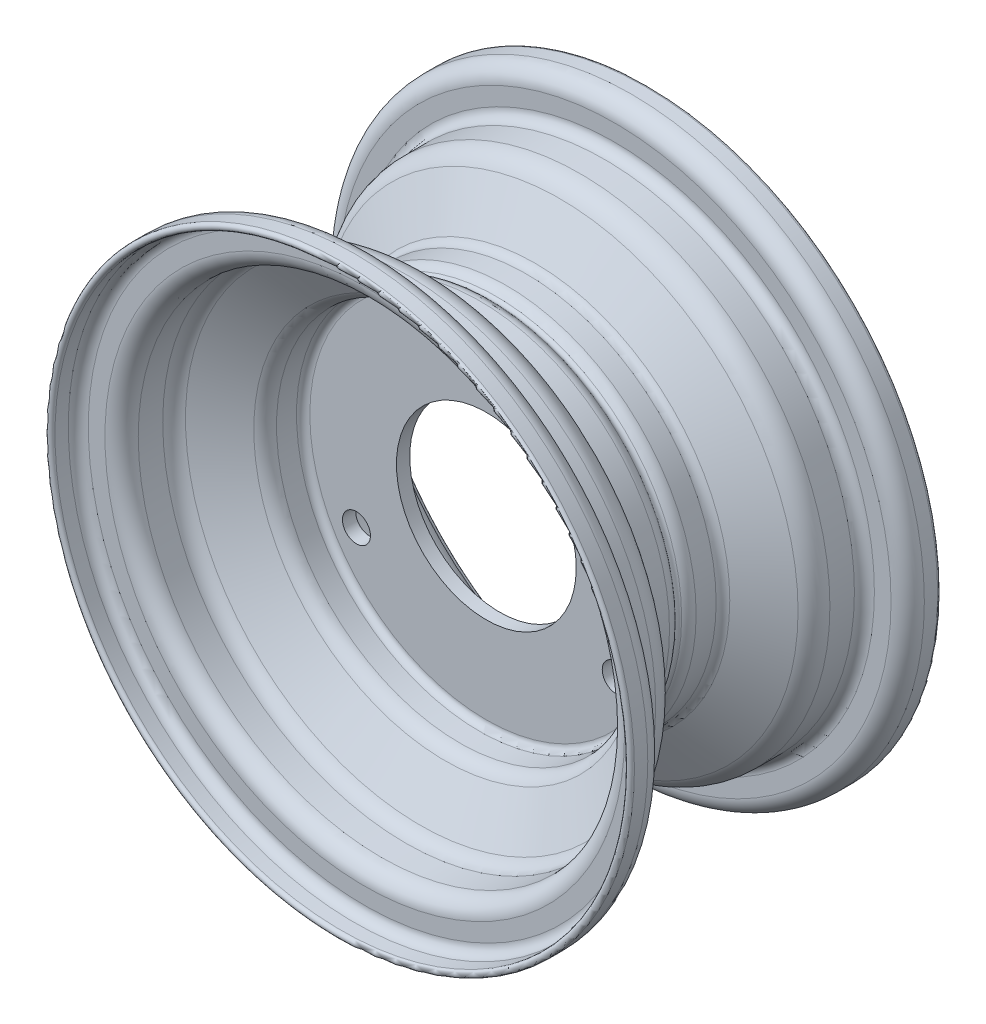
ISO-10303-21;
HEADER;
FILE_DESCRIPTION(('STEP AP214'),'2;1');
FILE_NAME('part.step','',(''),(''),'','','');
FILE_SCHEMA(('AUTOMOTIVE_DESIGN { 1 0 10303 214 1 1 1 1 }'));
ENDSEC;
DATA;
#1=APPLICATION_CONTEXT('core data for automotive mechanical design processes');
#2=APPLICATION_PROTOCOL_DEFINITION('international standard','automotive_design',2000,#1);
#3=PRODUCT_CONTEXT('',#1,'mechanical');
#4=PRODUCT('Part','Part','',(#3));
#5=PRODUCT_RELATED_PRODUCT_CATEGORY('part','',(#4));
#6=PRODUCT_DEFINITION_FORMATION('','',#4);
#7=PRODUCT_DEFINITION_CONTEXT('part definition',#1,'design');
#8=PRODUCT_DEFINITION('design','',#6,#7);
#9=PRODUCT_DEFINITION_SHAPE('','',#8);
#10=(LENGTH_UNIT() NAMED_UNIT(*) SI_UNIT(.MILLI.,.METRE.));
#11=(NAMED_UNIT(*) PLANE_ANGLE_UNIT() SI_UNIT($,.RADIAN.));
#12=(NAMED_UNIT(*) SI_UNIT($,.STERADIAN.) SOLID_ANGLE_UNIT());
#13=UNCERTAINTY_MEASURE_WITH_UNIT(LENGTH_MEASURE(1.E-05),#10,'distance_accuracy_value','');
#14=(GEOMETRIC_REPRESENTATION_CONTEXT(3) GLOBAL_UNCERTAINTY_ASSIGNED_CONTEXT((#13)) GLOBAL_UNIT_ASSIGNED_CONTEXT((#10,
#11,#12)) REPRESENTATION_CONTEXT('',''));
#15=CARTESIAN_POINT('',(0.,0.,0.));
#16=DIRECTION('',(0.,0.,1.));
#17=DIRECTION('',(1.,0.,0.));
#18=AXIS2_PLACEMENT_3D('',#15,#16,#17);
#19=CARTESIAN_POINT('',(0.,0.,10.));
#20=DIRECTION('',(0.,0.,1.));
#21=DIRECTION('',(1.,0.,0.));
#22=AXIS2_PLACEMENT_3D('',#19,#20,#21);
#23=TOROIDAL_SURFACE('',#22,60.,5.);
#24=CARTESIAN_POINT('',(0.,0.,10.));
#25=DIRECTION('',(0.,0.,1.));
#26=DIRECTION('',(1.,0.,0.));
#27=AXIS2_PLACEMENT_3D('',#24,#25,#26);
#28=CIRCLE('',#27,55.);
#29=CARTESIAN_POINT('',(55.,0.,10.));
#30=VERTEX_POINT('',#29);
#31=EDGE_CURVE('E49',#30,#30,#28,.T.);
#32=ORIENTED_EDGE('',*,*,#31,.F.);
#33=EDGE_LOOP('',(#32));
#34=FACE_BOUND('',#33,.T.);
#35=CARTESIAN_POINT('',(0.,0.,14.3301270189222));
#36=DIRECTION('',(0.,0.,1.));
#37=DIRECTION('',(1.,0.,0.));
#38=AXIS2_PLACEMENT_3D('',#35,#36,#37);
#39=CIRCLE('',#38,57.5);
#40=CARTESIAN_POINT('',(57.5,0.,14.3301270189222));
#41=VERTEX_POINT('',#40);
#42=EDGE_CURVE('E10',#41,#41,#39,.T.);
#43=ORIENTED_EDGE('',*,*,#42,.T.);
#44=EDGE_LOOP('',(#43));
#45=FACE_BOUND('',#44,.T.);
#46=ADVANCED_FACE('F31',(#34,#45),#23,.T.);
#47=CARTESIAN_POINT('',(0.,0.,21.8356805183874));
#48=DIRECTION('',(0.,0.,1.));
#49=DIRECTION('',(1.,0.,0.));
#50=AXIS2_PLACEMENT_3D('',#47,#48,#49);
#51=CONICAL_SURFACE('',#50,70.5,1.0471975511966);
#52=ORIENTED_EDGE('',*,*,#42,.F.);
#53=EDGE_LOOP('',(#52));
#54=FACE_BOUND('',#53,.T.);
#55=CARTESIAN_POINT('',(0.,0.,21.8356805183874));
#56=DIRECTION('',(0.,0.,1.));
#57=DIRECTION('',(1.,0.,0.));
#58=AXIS2_PLACEMENT_3D('',#55,#56,#57);
#59=CIRCLE('',#58,70.5);
#60=CARTESIAN_POINT('',(70.5,0.,21.8356805183874));
#61=VERTEX_POINT('',#60);
#62=EDGE_CURVE('E38',#61,#61,#59,.T.);
#63=ORIENTED_EDGE('',*,*,#62,.T.);
#64=EDGE_LOOP('',(#63));
#65=FACE_BOUND('',#64,.T.);
#66=ADVANCED_FACE('F460',(#54,#65),#51,.F.);
#67=CARTESIAN_POINT('',(0.,0.,26.1658075373096));
#68=DIRECTION('',(0.,0.,1.));
#69=DIRECTION('',(1.,0.,0.));
#70=AXIS2_PLACEMENT_3D('',#67,#68,#69);
#71=TOROIDAL_SURFACE('',#70,68.,5.);
#72=ORIENTED_EDGE('',*,*,#62,.F.);
#73=EDGE_LOOP('',(#72));
#74=FACE_BOUND('',#73,.T.);
#75=CARTESIAN_POINT('',(0.,0.,26.1658075373096));
#76=DIRECTION('',(0.,0.,1.));
#77=DIRECTION('',(1.,0.,0.));
#78=AXIS2_PLACEMENT_3D('',#75,#76,#77);
#79=CIRCLE('',#78,73.);
#80=CARTESIAN_POINT('',(73.,0.,26.1658075373096));
#81=VERTEX_POINT('',#80);
#82=EDGE_CURVE('E43',#81,#81,#79,.T.);
#83=ORIENTED_EDGE('',*,*,#82,.T.);
#84=EDGE_LOOP('',(#83));
#85=FACE_BOUND('',#84,.T.);
#86=ADVANCED_FACE('F196',(#74,#85),#71,.F.);
#87=CARTESIAN_POINT('',(0.,0.,10.1111111111111));
#88=DIRECTION('',(0.,0.,1.));
#89=DIRECTION('',(1.,0.,0.));
#90=AXIS2_PLACEMENT_3D('',#87,#88,#89);
#91=CYLINDRICAL_SURFACE('',#90,73.);
#92=ORIENTED_EDGE('',*,*,#82,.F.);
#93=EDGE_LOOP('',(#92));
#94=FACE_BOUND('',#93,.T.);
#95=CARTESIAN_POINT('',(0.,0.,33.5213292810915));
#96=DIRECTION('',(0.,0.,1.));
#97=DIRECTION('',(1.,0.,0.));
#98=AXIS2_PLACEMENT_3D('',#95,#96,#97);
#99=CIRCLE('',#98,73.);
#100=CARTESIAN_POINT('',(73.,0.,33.5213292810915));
#101=VERTEX_POINT('',#100);
#102=EDGE_CURVE('E191',#101,#101,#99,.T.);
#103=ORIENTED_EDGE('',*,*,#102,.T.);
#104=EDGE_LOOP('',(#103));
#105=FACE_BOUND('',#104,.T.);
#106=ADVANCED_FACE('F198',(#94,#105),#91,.F.);
#107=CARTESIAN_POINT('',(0.,0.,33.5213292810915));
#108=DIRECTION('',(0.,0.,1.));
#109=DIRECTION('',(1.,0.,0.));
#110=AXIS2_PLACEMENT_3D('',#107,#108,#109);
#111=TOROIDAL_SURFACE('',#110,78.,5.);
#112=ORIENTED_EDGE('',*,*,#102,.F.);
#113=EDGE_LOOP('',(#112));
#114=FACE_BOUND('',#113,.T.);
#115=CARTESIAN_POINT('',(0.,0.,38.5213292810915));
#116=DIRECTION('',(0.,0.,1.));
#117=DIRECTION('',(1.,0.,0.));
#118=AXIS2_PLACEMENT_3D('',#115,#116,#117);
#119=CIRCLE('',#118,78.);
#120=CARTESIAN_POINT('',(78.,0.,38.5213292810915));
#121=VERTEX_POINT('',#120);
#122=EDGE_CURVE('E188',#121,#121,#119,.T.);
#123=ORIENTED_EDGE('',*,*,#122,.T.);
#124=EDGE_LOOP('',(#123));
#125=FACE_BOUND('',#124,.T.);
#126=ADVANCED_FACE('F201',(#114,#125),#111,.T.);
#127=CARTESIAN_POINT('',(0.,78.,38.5213292810915));
#128=DIRECTION('',(0.,0.,-1.));
#129=DIRECTION('',(-1.,0.,0.));
#130=AXIS2_PLACEMENT_3D('',#127,#128,#129);
#131=PLANE('',#130);
#132=ORIENTED_EDGE('',*,*,#122,.F.);
#133=EDGE_LOOP('',(#132));
#134=FACE_BOUND('',#133,.T.);
#135=CARTESIAN_POINT('',(0.,0.,38.5213292810915));
#136=DIRECTION('',(0.,0.,1.));
#137=DIRECTION('',(1.,0.,0.));
#138=AXIS2_PLACEMENT_3D('',#135,#136,#137);
#139=CIRCLE('',#138,83.);
#140=CARTESIAN_POINT('',(83.,0.,38.5213292810915));
#141=VERTEX_POINT('',#140);
#142=EDGE_CURVE('E185',#141,#141,#139,.T.);
#143=ORIENTED_EDGE('',*,*,#142,.T.);
#144=EDGE_LOOP('',(#143));
#145=FACE_BOUND('',#144,.T.);
#146=ADVANCED_FACE('F207',(#134,#145),#131,.F.);
#147=CARTESIAN_POINT('',(0.,0.,41.5213292810915));
#148=DIRECTION('',(0.,0.,1.));
#149=DIRECTION('',(1.,0.,0.));
#150=AXIS2_PLACEMENT_3D('',#147,#148,#149);
#151=TOROIDAL_SURFACE('',#150,83.,3.00000000000001);
#152=ORIENTED_EDGE('',*,*,#142,.F.);
#153=EDGE_LOOP('',(#152));
#154=FACE_BOUND('',#153,.T.);
#155=CARTESIAN_POINT('',(0.,0.,41.5213292810915));
#156=DIRECTION('',(0.,0.,1.));
#157=DIRECTION('',(1.,0.,0.));
#158=AXIS2_PLACEMENT_3D('',#155,#156,#157);
#159=CIRCLE('',#158,86.);
#160=CARTESIAN_POINT('',(86.,0.,41.5213292810915));
#161=VERTEX_POINT('',#160);
#162=EDGE_CURVE('E182',#161,#161,#159,.T.);
#163=ORIENTED_EDGE('',*,*,#162,.T.);
#164=EDGE_LOOP('',(#163));
#165=FACE_BOUND('',#164,.T.);
#166=ADVANCED_FACE('F213',(#154,#165),#151,.F.);
#167=CARTESIAN_POINT('',(0.,0.,10.1111111111111));
#168=DIRECTION('',(0.,0.,1.));
#169=DIRECTION('',(1.,0.,0.));
#170=AXIS2_PLACEMENT_3D('',#167,#168,#169);
#171=CYLINDRICAL_SURFACE('',#170,86.);
#172=ORIENTED_EDGE('',*,*,#162,.F.);
#173=EDGE_LOOP('',(#172));
#174=FACE_BOUND('',#173,.T.);
#175=CARTESIAN_POINT('',(0.,0.,45.5213292810915));
#176=DIRECTION('',(0.,0.,1.));
#177=DIRECTION('',(1.,0.,0.));
#178=AXIS2_PLACEMENT_3D('',#175,#176,#177);
#179=CIRCLE('',#178,86.);
#180=CARTESIAN_POINT('',(86.,0.,45.5213292810915));
#181=VERTEX_POINT('',#180);
#182=EDGE_CURVE('E179',#181,#181,#179,.T.);
#183=ORIENTED_EDGE('',*,*,#182,.T.);
#184=EDGE_LOOP('',(#183));
#185=FACE_BOUND('',#184,.T.);
#186=ADVANCED_FACE('F219',(#174,#185),#171,.F.);
#187=CARTESIAN_POINT('',(0.,0.,45.5213292810915));
#188=DIRECTION('',(0.,0.,1.));
#189=DIRECTION('',(1.,0.,0.));
#190=AXIS2_PLACEMENT_3D('',#187,#188,#189);
#191=TOROIDAL_SURFACE('',#190,87.,1.);
#192=ORIENTED_EDGE('',*,*,#182,.F.);
#193=EDGE_LOOP('',(#192));
#194=FACE_BOUND('',#193,.T.);
#195=CARTESIAN_POINT('',(0.,0.,45.5213292810915));
#196=DIRECTION('',(0.,0.,1.));
#197=DIRECTION('',(1.,0.,0.));
#198=AXIS2_PLACEMENT_3D('',#195,#196,#197);
#199=CIRCLE('',#198,88.);
#200=CARTESIAN_POINT('',(88.,0.,45.5213292810915));
#201=VERTEX_POINT('',#200);
#202=EDGE_CURVE('E176',#201,#201,#199,.T.);
#203=ORIENTED_EDGE('',*,*,#202,.T.);
#204=EDGE_LOOP('',(#203));
#205=FACE_BOUND('',#204,.T.);
#206=ADVANCED_FACE('F225',(#194,#205),#191,.T.);
#207=CARTESIAN_POINT('',(0.,0.,10.1111111111111));
#208=DIRECTION('',(0.,0.,1.));
#209=DIRECTION('',(1.,0.,0.));
#210=AXIS2_PLACEMENT_3D('',#207,#208,#209);
#211=CYLINDRICAL_SURFACE('',#210,88.);
#212=ORIENTED_EDGE('',*,*,#202,.F.);
#213=EDGE_LOOP('',(#212));
#214=FACE_BOUND('',#213,.T.);
#215=CARTESIAN_POINT('',(0.,0.,41.5213292810915));
#216=DIRECTION('',(0.,0.,1.));
#217=DIRECTION('',(1.,0.,0.));
#218=AXIS2_PLACEMENT_3D('',#215,#216,#217);
#219=CIRCLE('',#218,88.);
#220=CARTESIAN_POINT('',(88.,0.,41.5213292810915));
#221=VERTEX_POINT('',#220);
#222=EDGE_CURVE('E173',#221,#221,#219,.T.);
#223=ORIENTED_EDGE('',*,*,#222,.T.);
#224=EDGE_LOOP('',(#223));
#225=FACE_BOUND('',#224,.T.);
#226=ADVANCED_FACE('F231',(#214,#225),#211,.T.);
#227=CARTESIAN_POINT('',(0.,0.,41.5213292810915));
#228=DIRECTION('',(0.,0.,1.));
#229=DIRECTION('',(1.,0.,0.));
#230=AXIS2_PLACEMENT_3D('',#227,#228,#229);
#231=TOROIDAL_SURFACE('',#230,83.,5.);
#232=ORIENTED_EDGE('',*,*,#222,.F.);
#233=EDGE_LOOP('',(#232));
#234=FACE_BOUND('',#233,.T.);
#235=CARTESIAN_POINT('',(0.,0.,36.5213292810915));
#236=DIRECTION('',(0.,0.,1.));
#237=DIRECTION('',(1.,0.,0.));
#238=AXIS2_PLACEMENT_3D('',#235,#236,#237);
#239=CIRCLE('',#238,83.);
#240=CARTESIAN_POINT('',(83.,0.,36.5213292810915));
#241=VERTEX_POINT('',#240);
#242=EDGE_CURVE('E170',#241,#241,#239,.T.);
#243=ORIENTED_EDGE('',*,*,#242,.T.);
#244=EDGE_LOOP('',(#243));
#245=FACE_BOUND('',#244,.T.);
#246=ADVANCED_FACE('F237',(#234,#245),#231,.T.);
#247=CARTESIAN_POINT('',(0.,83.,36.5213292810915));
#248=DIRECTION('',(0.,0.,1.));
#249=DIRECTION('',(1.,0.,0.));
#250=AXIS2_PLACEMENT_3D('',#247,#248,#249);
#251=PLANE('',#250);
#252=ORIENTED_EDGE('',*,*,#242,.F.);
#253=EDGE_LOOP('',(#252));
#254=FACE_BOUND('',#253,.T.);
#255=CARTESIAN_POINT('',(0.,0.,36.5213292810915));
#256=DIRECTION('',(0.,0.,1.));
#257=DIRECTION('',(1.,0.,0.));
#258=AXIS2_PLACEMENT_3D('',#255,#256,#257);
#259=CIRCLE('',#258,78.);
#260=CARTESIAN_POINT('',(78.,0.,36.5213292810915));
#261=VERTEX_POINT('',#260);
#262=EDGE_CURVE('E167',#261,#261,#259,.T.);
#263=ORIENTED_EDGE('',*,*,#262,.T.);
#264=EDGE_LOOP('',(#263));
#265=FACE_BOUND('',#264,.T.);
#266=ADVANCED_FACE('F243',(#254,#265),#251,.F.);
#267=CARTESIAN_POINT('',(0.,0.,33.5213292810915));
#268=DIRECTION('',(0.,0.,1.));
#269=DIRECTION('',(1.,0.,0.));
#270=AXIS2_PLACEMENT_3D('',#267,#268,#269);
#271=TOROIDAL_SURFACE('',#270,78.,3.);
#272=ORIENTED_EDGE('',*,*,#262,.F.);
#273=EDGE_LOOP('',(#272));
#274=FACE_BOUND('',#273,.T.);
#275=CARTESIAN_POINT('',(0.,0.,33.5213292810915));
#276=DIRECTION('',(0.,0.,1.));
#277=DIRECTION('',(1.,0.,0.));
#278=AXIS2_PLACEMENT_3D('',#275,#276,#277);
#279=CIRCLE('',#278,75.);
#280=CARTESIAN_POINT('',(75.,0.,33.5213292810915));
#281=VERTEX_POINT('',#280);
#282=EDGE_CURVE('E164',#281,#281,#279,.T.);
#283=ORIENTED_EDGE('',*,*,#282,.T.);
#284=EDGE_LOOP('',(#283));
#285=FACE_BOUND('',#284,.T.);
#286=ADVANCED_FACE('F249',(#274,#285),#271,.F.);
#287=CARTESIAN_POINT('',(0.,0.,10.1111111111111));
#288=DIRECTION('',(0.,0.,1.));
#289=DIRECTION('',(1.,0.,0.));
#290=AXIS2_PLACEMENT_3D('',#287,#288,#289);
#291=CYLINDRICAL_SURFACE('',#290,75.);
#292=ORIENTED_EDGE('',*,*,#282,.F.);
#293=EDGE_LOOP('',(#292));
#294=FACE_BOUND('',#293,.T.);
#295=CARTESIAN_POINT('',(0.,0.,26.1658075373096));
#296=DIRECTION('',(0.,0.,1.));
#297=DIRECTION('',(1.,0.,0.));
#298=AXIS2_PLACEMENT_3D('',#295,#296,#297);
#299=CIRCLE('',#298,75.);
#300=CARTESIAN_POINT('',(75.,0.,26.1658075373096));
#301=VERTEX_POINT('',#300);
#302=EDGE_CURVE('E161',#301,#301,#299,.T.);
#303=ORIENTED_EDGE('',*,*,#302,.T.);
#304=EDGE_LOOP('',(#303));
#305=FACE_BOUND('',#304,.T.);
#306=ADVANCED_FACE('F255',(#294,#305),#291,.T.);
#307=CARTESIAN_POINT('',(0.,0.,26.1658075373096));
#308=DIRECTION('',(0.,0.,1.));
#309=DIRECTION('',(1.,0.,0.));
#310=AXIS2_PLACEMENT_3D('',#307,#308,#309);
#311=TOROIDAL_SURFACE('',#310,68.,7.00000000000003);
#312=ORIENTED_EDGE('',*,*,#302,.F.);
#313=EDGE_LOOP('',(#312));
#314=FACE_BOUND('',#313,.T.);
#315=CARTESIAN_POINT('',(0.,0.,20.1036297108185));
#316=DIRECTION('',(0.,0.,1.));
#317=DIRECTION('',(1.,0.,0.));
#318=AXIS2_PLACEMENT_3D('',#315,#316,#317);
#319=CIRCLE('',#318,71.5);
#320=CARTESIAN_POINT('',(71.5,0.,20.1036297108185));
#321=VERTEX_POINT('',#320);
#322=EDGE_CURVE('E158',#321,#321,#319,.T.);
#323=ORIENTED_EDGE('',*,*,#322,.T.);
#324=EDGE_LOOP('',(#323));
#325=FACE_BOUND('',#324,.T.);
#326=ADVANCED_FACE('F261',(#314,#325),#311,.T.);
#327=CARTESIAN_POINT('',(0.,0.,12.5980762113533));
#328=DIRECTION('',(0.,0.,1.));
#329=DIRECTION('',(1.,0.,0.));
#330=AXIS2_PLACEMENT_3D('',#327,#328,#329);
#331=CONICAL_SURFACE('',#330,58.5,1.0471975511966);
#332=ORIENTED_EDGE('',*,*,#322,.F.);
#333=EDGE_LOOP('',(#332));
#334=FACE_BOUND('',#333,.T.);
#335=CARTESIAN_POINT('',(0.,0.,12.5980762113533));
#336=DIRECTION('',(0.,0.,1.));
#337=DIRECTION('',(1.,0.,0.));
#338=AXIS2_PLACEMENT_3D('',#335,#336,#337);
#339=CIRCLE('',#338,58.5);
#340=CARTESIAN_POINT('',(58.5,0.,12.5980762113533));
#341=VERTEX_POINT('',#340);
#342=EDGE_CURVE('E155',#341,#341,#339,.T.);
#343=ORIENTED_EDGE('',*,*,#342,.T.);
#344=EDGE_LOOP('',(#343));
#345=FACE_BOUND('',#344,.T.);
#346=ADVANCED_FACE('F267',(#334,#345),#331,.T.);
#347=CARTESIAN_POINT('',(0.,0.,10.));
#348=DIRECTION('',(0.,0.,1.));
#349=DIRECTION('',(1.,0.,0.));
#350=AXIS2_PLACEMENT_3D('',#347,#348,#349);
#351=TOROIDAL_SURFACE('',#350,60.,2.99999999999997);
#352=ORIENTED_EDGE('',*,*,#342,.F.);
#353=EDGE_LOOP('',(#352));
#354=FACE_BOUND('',#353,.T.);
#355=CARTESIAN_POINT('',(0.,0.,10.));
#356=DIRECTION('',(0.,0.,1.));
#357=DIRECTION('',(1.,0.,0.));
#358=AXIS2_PLACEMENT_3D('',#355,#356,#357);
#359=CIRCLE('',#358,57.);
#360=CARTESIAN_POINT('',(57.,0.,10.));
#361=VERTEX_POINT('',#360);
#362=EDGE_CURVE('E152',#361,#361,#359,.T.);
#363=ORIENTED_EDGE('',*,*,#362,.T.);
#364=EDGE_LOOP('',(#363));
#365=FACE_BOUND('',#364,.T.);
#366=ADVANCED_FACE('F273',(#354,#365),#351,.F.);
#367=CARTESIAN_POINT('',(0.,0.,10.1111111111111));
#368=DIRECTION('',(0.,0.,1.));
#369=DIRECTION('',(1.,0.,0.));
#370=AXIS2_PLACEMENT_3D('',#367,#368,#369);
#371=CYLINDRICAL_SURFACE('',#370,57.);
#372=ORIENTED_EDGE('',*,*,#362,.F.);
#373=EDGE_LOOP('',(#372));
#374=FACE_BOUND('',#373,.T.);
#375=CARTESIAN_POINT('',(0.,0.,4.));
#376=DIRECTION('',(0.,0.,1.));
#377=DIRECTION('',(1.,0.,0.));
#378=AXIS2_PLACEMENT_3D('',#375,#376,#377);
#379=CIRCLE('',#378,57.);
#380=CARTESIAN_POINT('',(57.,0.,4.));
#381=VERTEX_POINT('',#380);
#382=EDGE_CURVE('E149',#381,#381,#379,.T.);
#383=ORIENTED_EDGE('',*,*,#382,.T.);
#384=EDGE_LOOP('',(#383));
#385=FACE_BOUND('',#384,.T.);
#386=ADVANCED_FACE('F279',(#374,#385),#371,.T.);
#387=CARTESIAN_POINT('',(0.,0.,4.));
#388=DIRECTION('',(0.,0.,1.));
#389=DIRECTION('',(1.,0.,0.));
#390=AXIS2_PLACEMENT_3D('',#387,#388,#389);
#391=TOROIDAL_SURFACE('',#390,53.,4.00000000000001);
#392=ORIENTED_EDGE('',*,*,#382,.F.);
#393=EDGE_LOOP('',(#392));
#394=FACE_BOUND('',#393,.T.);
#395=CARTESIAN_POINT('',(0.,0.,1.));
#396=DIRECTION('',(0.,0.,1.));
#397=DIRECTION('',(1.,0.,0.));
#398=AXIS2_PLACEMENT_3D('',#395,#396,#397);
#399=CIRCLE('',#398,55.6457513110646);
#400=CARTESIAN_POINT('',(55.6457513110646,0.,1.));
#401=VERTEX_POINT('',#400);
#402=EDGE_CURVE('E146',#401,#401,#399,.T.);
#403=ORIENTED_EDGE('',*,*,#402,.T.);
#404=EDGE_LOOP('',(#403));
#405=FACE_BOUND('',#404,.T.);
#406=ADVANCED_FACE('F285',(#394,#405),#391,.T.);
#407=CARTESIAN_POINT('',(0.,0.,0.));
#408=DIRECTION('',(0.,0.,1.));
#409=DIRECTION('',(1.,0.,0.));
#410=AXIS2_PLACEMENT_3D('',#407,#408,#409);
#411=TOROIDAL_SURFACE('',#410,56.5276684147528,1.33333333333334);
#412=ORIENTED_EDGE('',*,*,#402,.F.);
#413=EDGE_LOOP('',(#412));
#414=FACE_BOUND('',#413,.T.);
#415=CARTESIAN_POINT('',(0.,0.,-0.999999999999997));
#416=DIRECTION('',(0.,0.,1.));
#417=DIRECTION('',(1.,0.,0.));
#418=AXIS2_PLACEMENT_3D('',#415,#416,#417);
#419=CIRCLE('',#418,55.6457513110646);
#420=CARTESIAN_POINT('',(55.6457513110646,0.,-0.999999999999997));
#421=VERTEX_POINT('',#420);
#422=EDGE_CURVE('E143',#421,#421,#419,.T.);
#423=ORIENTED_EDGE('',*,*,#422,.T.);
#424=EDGE_LOOP('',(#423));
#425=FACE_BOUND('',#424,.T.);
#426=ADVANCED_FACE('F291',(#414,#425),#411,.F.);
#427=CARTESIAN_POINT('',(0.,0.,-4.));
#428=DIRECTION('',(0.,0.,1.));
#429=DIRECTION('',(1.,0.,0.));
#430=AXIS2_PLACEMENT_3D('',#427,#428,#429);
#431=TOROIDAL_SURFACE('',#430,53.,4.00000000000001);
#432=ORIENTED_EDGE('',*,*,#422,.F.);
#433=EDGE_LOOP('',(#432));
#434=FACE_BOUND('',#433,.T.);
#435=CARTESIAN_POINT('',(0.,0.,-4.00000000000005));
#436=DIRECTION('',(0.,0.,1.));
#437=DIRECTION('',(1.,0.,0.));
#438=AXIS2_PLACEMENT_3D('',#435,#436,#437);
#439=CIRCLE('',#438,57.);
#440=CARTESIAN_POINT('',(57.,0.,-4.00000000000005));
#441=VERTEX_POINT('',#440);
#442=EDGE_CURVE('E140',#441,#441,#439,.T.);
#443=ORIENTED_EDGE('',*,*,#442,.T.);
#444=EDGE_LOOP('',(#443));
#445=FACE_BOUND('',#444,.T.);
#446=ADVANCED_FACE('F297',(#434,#445),#431,.T.);
#447=CARTESIAN_POINT('',(0.,0.,10.1111111111111));
#448=DIRECTION('',(0.,0.,1.));
#449=DIRECTION('',(1.,0.,0.));
#450=AXIS2_PLACEMENT_3D('',#447,#448,#449);
#451=CYLINDRICAL_SURFACE('',#450,57.);
#452=ORIENTED_EDGE('',*,*,#442,.F.);
#453=EDGE_LOOP('',(#452));
#454=FACE_BOUND('',#453,.T.);
#455=CARTESIAN_POINT('',(0.,0.,-10.));
#456=DIRECTION('',(0.,0.,1.));
#457=DIRECTION('',(1.,0.,0.));
#458=AXIS2_PLACEMENT_3D('',#455,#456,#457);
#459=CIRCLE('',#458,57.);
#460=CARTESIAN_POINT('',(57.,0.,-10.));
#461=VERTEX_POINT('',#460);
#462=EDGE_CURVE('E137',#461,#461,#459,.T.);
#463=ORIENTED_EDGE('',*,*,#462,.T.);
#464=EDGE_LOOP('',(#463));
#465=FACE_BOUND('',#464,.T.);
#466=ADVANCED_FACE('F303',(#454,#465),#451,.T.);
#467=CARTESIAN_POINT('',(0.,0.,-10.));
#468=DIRECTION('',(0.,0.,1.));
#469=DIRECTION('',(1.,0.,0.));
#470=AXIS2_PLACEMENT_3D('',#467,#468,#469);
#471=TOROIDAL_SURFACE('',#470,60.,2.99999999999999);
#472=ORIENTED_EDGE('',*,*,#462,.F.);
#473=EDGE_LOOP('',(#472));
#474=FACE_BOUND('',#473,.T.);
#475=CARTESIAN_POINT('',(0.,0.,-12.5980762113533));
#476=DIRECTION('',(0.,0.,1.));
#477=DIRECTION('',(1.,0.,0.));
#478=AXIS2_PLACEMENT_3D('',#475,#476,#477);
#479=CIRCLE('',#478,58.5);
#480=CARTESIAN_POINT('',(58.5,0.,-12.5980762113533));
#481=VERTEX_POINT('',#480);
#482=EDGE_CURVE('E134',#481,#481,#479,.T.);
#483=ORIENTED_EDGE('',*,*,#482,.T.);
#484=EDGE_LOOP('',(#483));
#485=FACE_BOUND('',#484,.T.);
#486=ADVANCED_FACE('F309',(#474,#485),#471,.F.);
#487=CARTESIAN_POINT('',(0.,0.,-20.1036297108185));
#488=DIRECTION('',(0.,0.,-1.));
#489=DIRECTION('',(-1.,0.,0.));
#490=AXIS2_PLACEMENT_3D('',#487,#488,#489);
#491=CONICAL_SURFACE('',#490,71.5,1.0471975511966);
#492=ORIENTED_EDGE('',*,*,#482,.F.);
#493=EDGE_LOOP('',(#492));
#494=FACE_BOUND('',#493,.T.);
#495=CARTESIAN_POINT('',(0.,0.,-20.1036297108185));
#496=DIRECTION('',(0.,0.,1.));
#497=DIRECTION('',(1.,0.,0.));
#498=AXIS2_PLACEMENT_3D('',#495,#496,#497);
#499=CIRCLE('',#498,71.5);
#500=CARTESIAN_POINT('',(71.5,0.,-20.1036297108185));
#501=VERTEX_POINT('',#500);
#502=EDGE_CURVE('E131',#501,#501,#499,.T.);
#503=ORIENTED_EDGE('',*,*,#502,.T.);
#504=EDGE_LOOP('',(#503));
#505=FACE_BOUND('',#504,.T.);
#506=ADVANCED_FACE('F315',(#494,#505),#491,.T.);
#507=CARTESIAN_POINT('',(0.,0.,-26.1658075373096));
#508=DIRECTION('',(0.,0.,1.));
#509=DIRECTION('',(1.,0.,0.));
#510=AXIS2_PLACEMENT_3D('',#507,#508,#509);
#511=TOROIDAL_SURFACE('',#510,68.,7.00000000000001);
#512=ORIENTED_EDGE('',*,*,#502,.F.);
#513=EDGE_LOOP('',(#512));
#514=FACE_BOUND('',#513,.T.);
#515=CARTESIAN_POINT('',(0.,0.,-26.1658075373096));
#516=DIRECTION('',(0.,0.,1.));
#517=DIRECTION('',(1.,0.,0.));
#518=AXIS2_PLACEMENT_3D('',#515,#516,#517);
#519=CIRCLE('',#518,75.);
#520=CARTESIAN_POINT('',(75.,0.,-26.1658075373096));
#521=VERTEX_POINT('',#520);
#522=EDGE_CURVE('E128',#521,#521,#519,.T.);
#523=ORIENTED_EDGE('',*,*,#522,.T.);
#524=EDGE_LOOP('',(#523));
#525=FACE_BOUND('',#524,.T.);
#526=ADVANCED_FACE('F321',(#514,#525),#511,.T.);
#527=CARTESIAN_POINT('',(0.,0.,10.1111111111111));
#528=DIRECTION('',(0.,0.,1.));
#529=DIRECTION('',(1.,0.,0.));
#530=AXIS2_PLACEMENT_3D('',#527,#528,#529);
#531=CYLINDRICAL_SURFACE('',#530,75.);
#532=ORIENTED_EDGE('',*,*,#522,.F.);
#533=EDGE_LOOP('',(#532));
#534=FACE_BOUND('',#533,.T.);
#535=CARTESIAN_POINT('',(0.,0.,-33.5213292810915));
#536=DIRECTION('',(0.,0.,1.));
#537=DIRECTION('',(1.,0.,0.));
#538=AXIS2_PLACEMENT_3D('',#535,#536,#537);
#539=CIRCLE('',#538,75.);
#540=CARTESIAN_POINT('',(75.,0.,-33.5213292810915));
#541=VERTEX_POINT('',#540);
#542=EDGE_CURVE('E125',#541,#541,#539,.T.);
#543=ORIENTED_EDGE('',*,*,#542,.T.);
#544=EDGE_LOOP('',(#543));
#545=FACE_BOUND('',#544,.T.);
#546=ADVANCED_FACE('F327',(#534,#545),#531,.T.);
#547=CARTESIAN_POINT('',(0.,0.,-33.5213292810915));
#548=DIRECTION('',(0.,0.,1.));
#549=DIRECTION('',(1.,0.,0.));
#550=AXIS2_PLACEMENT_3D('',#547,#548,#549);
#551=TOROIDAL_SURFACE('',#550,78.,3.);
#552=ORIENTED_EDGE('',*,*,#542,.F.);
#553=EDGE_LOOP('',(#552));
#554=FACE_BOUND('',#553,.T.);
#555=CARTESIAN_POINT('',(0.,0.,-36.5213292810915));
#556=DIRECTION('',(0.,0.,1.));
#557=DIRECTION('',(1.,0.,0.));
#558=AXIS2_PLACEMENT_3D('',#555,#556,#557);
#559=CIRCLE('',#558,78.);
#560=CARTESIAN_POINT('',(78.,0.,-36.5213292810915));
#561=VERTEX_POINT('',#560);
#562=EDGE_CURVE('E122',#561,#561,#559,.T.);
#563=ORIENTED_EDGE('',*,*,#562,.T.);
#564=EDGE_LOOP('',(#563));
#565=FACE_BOUND('',#564,.T.);
#566=ADVANCED_FACE('F333',(#554,#565),#551,.F.);
#567=CARTESIAN_POINT('',(0.,83.,-36.5213292810915));
#568=DIRECTION('',(0.,0.,-1.));
#569=DIRECTION('',(-1.,0.,0.));
#570=AXIS2_PLACEMENT_3D('',#567,#568,#569);
#571=PLANE('',#570);
#572=ORIENTED_EDGE('',*,*,#562,.F.);
#573=EDGE_LOOP('',(#572));
#574=FACE_BOUND('',#573,.T.);
#575=CARTESIAN_POINT('',(0.,0.,-36.5213292810915));
#576=DIRECTION('',(0.,0.,1.));
#577=DIRECTION('',(1.,0.,0.));
#578=AXIS2_PLACEMENT_3D('',#575,#576,#577);
#579=CIRCLE('',#578,83.);
#580=CARTESIAN_POINT('',(83.,0.,-36.5213292810915));
#581=VERTEX_POINT('',#580);
#582=EDGE_CURVE('E119',#581,#581,#579,.T.);
#583=ORIENTED_EDGE('',*,*,#582,.T.);
#584=EDGE_LOOP('',(#583));
#585=FACE_BOUND('',#584,.T.);
#586=ADVANCED_FACE('F339',(#574,#585),#571,.F.);
#587=CARTESIAN_POINT('',(0.,0.,-41.5213292810915));
#588=DIRECTION('',(0.,0.,1.));
#589=DIRECTION('',(1.,0.,0.));
#590=AXIS2_PLACEMENT_3D('',#587,#588,#589);
#591=TOROIDAL_SURFACE('',#590,83.,5.);
#592=ORIENTED_EDGE('',*,*,#582,.F.);
#593=EDGE_LOOP('',(#592));
#594=FACE_BOUND('',#593,.T.);
#595=CARTESIAN_POINT('',(0.,0.,-41.5213292810915));
#596=DIRECTION('',(0.,0.,1.));
#597=DIRECTION('',(1.,0.,0.));
#598=AXIS2_PLACEMENT_3D('',#595,#596,#597);
#599=CIRCLE('',#598,88.);
#600=CARTESIAN_POINT('',(88.,0.,-41.5213292810915));
#601=VERTEX_POINT('',#600);
#602=EDGE_CURVE('E116',#601,#601,#599,.T.);
#603=ORIENTED_EDGE('',*,*,#602,.T.);
#604=EDGE_LOOP('',(#603));
#605=FACE_BOUND('',#604,.T.);
#606=ADVANCED_FACE('F345',(#594,#605),#591,.T.);
#607=CARTESIAN_POINT('',(0.,0.,10.1111111111111));
#608=DIRECTION('',(0.,0.,1.));
#609=DIRECTION('',(1.,0.,0.));
#610=AXIS2_PLACEMENT_3D('',#607,#608,#609);
#611=CYLINDRICAL_SURFACE('',#610,88.);
#612=ORIENTED_EDGE('',*,*,#602,.F.);
#613=EDGE_LOOP('',(#612));
#614=FACE_BOUND('',#613,.T.);
#615=CARTESIAN_POINT('',(0.,0.,-45.5213292810915));
#616=DIRECTION('',(0.,0.,1.));
#617=DIRECTION('',(1.,0.,0.));
#618=AXIS2_PLACEMENT_3D('',#615,#616,#617);
#619=CIRCLE('',#618,88.);
#620=CARTESIAN_POINT('',(88.,0.,-45.5213292810915));
#621=VERTEX_POINT('',#620);
#622=EDGE_CURVE('E113',#621,#621,#619,.T.);
#623=ORIENTED_EDGE('',*,*,#622,.T.);
#624=EDGE_LOOP('',(#623));
#625=FACE_BOUND('',#624,.T.);
#626=ADVANCED_FACE('F351',(#614,#625),#611,.T.);
#627=CARTESIAN_POINT('',(0.,0.,-45.5213292810915));
#628=DIRECTION('',(0.,0.,1.));
#629=DIRECTION('',(1.,0.,0.));
#630=AXIS2_PLACEMENT_3D('',#627,#628,#629);
#631=TOROIDAL_SURFACE('',#630,87.,1.);
#632=ORIENTED_EDGE('',*,*,#622,.F.);
#633=EDGE_LOOP('',(#632));
#634=FACE_BOUND('',#633,.T.);
#635=CARTESIAN_POINT('',(0.,0.,-45.5213292810915));
#636=DIRECTION('',(0.,0.,1.));
#637=DIRECTION('',(1.,0.,0.));
#638=AXIS2_PLACEMENT_3D('',#635,#636,#637);
#639=CIRCLE('',#638,86.);
#640=CARTESIAN_POINT('',(86.,0.,-45.5213292810915));
#641=VERTEX_POINT('',#640);
#642=EDGE_CURVE('E110',#641,#641,#639,.T.);
#643=ORIENTED_EDGE('',*,*,#642,.T.);
#644=EDGE_LOOP('',(#643));
#645=FACE_BOUND('',#644,.T.);
#646=ADVANCED_FACE('F357',(#634,#645),#631,.T.);
#647=CARTESIAN_POINT('',(0.,0.,10.1111111111111));
#648=DIRECTION('',(0.,0.,1.));
#649=DIRECTION('',(1.,0.,0.));
#650=AXIS2_PLACEMENT_3D('',#647,#648,#649);
#651=CYLINDRICAL_SURFACE('',#650,86.);
#652=ORIENTED_EDGE('',*,*,#642,.F.);
#653=EDGE_LOOP('',(#652));
#654=FACE_BOUND('',#653,.T.);
#655=CARTESIAN_POINT('',(0.,0.,-41.5213292810915));
#656=DIRECTION('',(0.,0.,1.));
#657=DIRECTION('',(1.,0.,0.));
#658=AXIS2_PLACEMENT_3D('',#655,#656,#657);
#659=CIRCLE('',#658,86.);
#660=CARTESIAN_POINT('',(86.,0.,-41.5213292810915));
#661=VERTEX_POINT('',#660);
#662=EDGE_CURVE('E107',#661,#661,#659,.T.);
#663=ORIENTED_EDGE('',*,*,#662,.T.);
#664=EDGE_LOOP('',(#663));
#665=FACE_BOUND('',#664,.T.);
#666=ADVANCED_FACE('F363',(#654,#665),#651,.F.);
#667=CARTESIAN_POINT('',(0.,0.,-41.5213292810915));
#668=DIRECTION('',(0.,0.,1.));
#669=DIRECTION('',(1.,0.,0.));
#670=AXIS2_PLACEMENT_3D('',#667,#668,#669);
#671=TOROIDAL_SURFACE('',#670,83.,3.);
#672=ORIENTED_EDGE('',*,*,#662,.F.);
#673=EDGE_LOOP('',(#672));
#674=FACE_BOUND('',#673,.T.);
#675=CARTESIAN_POINT('',(0.,0.,-38.5213292810915));
#676=DIRECTION('',(0.,0.,1.));
#677=DIRECTION('',(1.,0.,0.));
#678=AXIS2_PLACEMENT_3D('',#675,#676,#677);
#679=CIRCLE('',#678,83.);
#680=CARTESIAN_POINT('',(83.,0.,-38.5213292810915));
#681=VERTEX_POINT('',#680);
#682=EDGE_CURVE('E104',#681,#681,#679,.T.);
#683=ORIENTED_EDGE('',*,*,#682,.T.);
#684=EDGE_LOOP('',(#683));
#685=FACE_BOUND('',#684,.T.);
#686=ADVANCED_FACE('F369',(#674,#685),#671,.F.);
#687=CARTESIAN_POINT('',(0.,78.,-38.5213292810915));
#688=DIRECTION('',(0.,0.,1.));
#689=DIRECTION('',(1.,0.,0.));
#690=AXIS2_PLACEMENT_3D('',#687,#688,#689);
#691=PLANE('',#690);
#692=ORIENTED_EDGE('',*,*,#682,.F.);
#693=EDGE_LOOP('',(#692));
#694=FACE_BOUND('',#693,.T.);
#695=CARTESIAN_POINT('',(0.,0.,-38.5213292810915));
#696=DIRECTION('',(0.,0.,1.));
#697=DIRECTION('',(1.,0.,0.));
#698=AXIS2_PLACEMENT_3D('',#695,#696,#697);
#699=CIRCLE('',#698,78.);
#700=CARTESIAN_POINT('',(78.,0.,-38.5213292810915));
#701=VERTEX_POINT('',#700);
#702=EDGE_CURVE('E101',#701,#701,#699,.T.);
#703=ORIENTED_EDGE('',*,*,#702,.T.);
#704=EDGE_LOOP('',(#703));
#705=FACE_BOUND('',#704,.T.);
#706=ADVANCED_FACE('F375',(#694,#705),#691,.F.);
#707=CARTESIAN_POINT('',(0.,0.,-33.5213292810915));
#708=DIRECTION('',(0.,0.,1.));
#709=DIRECTION('',(1.,0.,0.));
#710=AXIS2_PLACEMENT_3D('',#707,#708,#709);
#711=TOROIDAL_SURFACE('',#710,78.,5.00000000000001);
#712=ORIENTED_EDGE('',*,*,#702,.F.);
#713=EDGE_LOOP('',(#712));
#714=FACE_BOUND('',#713,.T.);
#715=CARTESIAN_POINT('',(0.,0.,-33.5213292810915));
#716=DIRECTION('',(0.,0.,1.));
#717=DIRECTION('',(1.,0.,0.));
#718=AXIS2_PLACEMENT_3D('',#715,#716,#717);
#719=CIRCLE('',#718,73.);
#720=CARTESIAN_POINT('',(73.,0.,-33.5213292810915));
#721=VERTEX_POINT('',#720);
#722=EDGE_CURVE('E98',#721,#721,#719,.T.);
#723=ORIENTED_EDGE('',*,*,#722,.T.);
#724=EDGE_LOOP('',(#723));
#725=FACE_BOUND('',#724,.T.);
#726=ADVANCED_FACE('F381',(#714,#725),#711,.T.);
#727=CARTESIAN_POINT('',(0.,0.,10.1111111111111));
#728=DIRECTION('',(0.,0.,1.));
#729=DIRECTION('',(1.,0.,0.));
#730=AXIS2_PLACEMENT_3D('',#727,#728,#729);
#731=CYLINDRICAL_SURFACE('',#730,73.);
#732=ORIENTED_EDGE('',*,*,#722,.F.);
#733=EDGE_LOOP('',(#732));
#734=FACE_BOUND('',#733,.T.);
#735=CARTESIAN_POINT('',(0.,0.,-26.1658075373096));
#736=DIRECTION('',(0.,0.,1.));
#737=DIRECTION('',(1.,0.,0.));
#738=AXIS2_PLACEMENT_3D('',#735,#736,#737);
#739=CIRCLE('',#738,73.);
#740=CARTESIAN_POINT('',(73.,0.,-26.1658075373096));
#741=VERTEX_POINT('',#740);
#742=EDGE_CURVE('E95',#741,#741,#739,.T.);
#743=ORIENTED_EDGE('',*,*,#742,.T.);
#744=EDGE_LOOP('',(#743));
#745=FACE_BOUND('',#744,.T.);
#746=ADVANCED_FACE('F387',(#734,#745),#731,.F.);
#747=CARTESIAN_POINT('',(0.,0.,-26.1658075373096));
#748=DIRECTION('',(0.,0.,1.));
#749=DIRECTION('',(1.,0.,0.));
#750=AXIS2_PLACEMENT_3D('',#747,#748,#749);
#751=TOROIDAL_SURFACE('',#750,68.,4.99999999999999);
#752=ORIENTED_EDGE('',*,*,#742,.F.);
#753=EDGE_LOOP('',(#752));
#754=FACE_BOUND('',#753,.T.);
#755=CARTESIAN_POINT('',(0.,0.,-21.8356805183874));
#756=DIRECTION('',(0.,0.,1.));
#757=DIRECTION('',(1.,0.,0.));
#758=AXIS2_PLACEMENT_3D('',#755,#756,#757);
#759=CIRCLE('',#758,70.5);
#760=CARTESIAN_POINT('',(70.5,0.,-21.8356805183874));
#761=VERTEX_POINT('',#760);
#762=EDGE_CURVE('E92',#761,#761,#759,.T.);
#763=ORIENTED_EDGE('',*,*,#762,.T.);
#764=EDGE_LOOP('',(#763));
#765=FACE_BOUND('',#764,.T.);
#766=ADVANCED_FACE('F393',(#754,#765),#751,.F.);
#767=CARTESIAN_POINT('',(0.,0.,-14.3301270189222));
#768=DIRECTION('',(0.,0.,-1.));
#769=DIRECTION('',(-1.,0.,0.));
#770=AXIS2_PLACEMENT_3D('',#767,#768,#769);
#771=CONICAL_SURFACE('',#770,57.5,1.04719755119659);
#772=ORIENTED_EDGE('',*,*,#762,.F.);
#773=EDGE_LOOP('',(#772));
#774=FACE_BOUND('',#773,.T.);
#775=CARTESIAN_POINT('',(0.,0.,-14.3301270189222));
#776=DIRECTION('',(0.,0.,1.));
#777=DIRECTION('',(1.,0.,0.));
#778=AXIS2_PLACEMENT_3D('',#775,#776,#777);
#779=CIRCLE('',#778,57.5);
#780=CARTESIAN_POINT('',(57.5,0.,-14.3301270189222));
#781=VERTEX_POINT('',#780);
#782=EDGE_CURVE('E89',#781,#781,#779,.T.);
#783=ORIENTED_EDGE('',*,*,#782,.T.);
#784=EDGE_LOOP('',(#783));
#785=FACE_BOUND('',#784,.T.);
#786=ADVANCED_FACE('F399',(#774,#785),#771,.F.);
#787=CARTESIAN_POINT('',(0.,0.,-10.));
#788=DIRECTION('',(0.,0.,1.));
#789=DIRECTION('',(1.,0.,0.));
#790=AXIS2_PLACEMENT_3D('',#787,#788,#789);
#791=TOROIDAL_SURFACE('',#790,60.,5.00000000000002);
#792=ORIENTED_EDGE('',*,*,#782,.F.);
#793=EDGE_LOOP('',(#792));
#794=FACE_BOUND('',#793,.T.);
#795=CARTESIAN_POINT('',(0.,0.,-10.));
#796=DIRECTION('',(0.,0.,1.));
#797=DIRECTION('',(1.,0.,0.));
#798=AXIS2_PLACEMENT_3D('',#795,#796,#797);
#799=CIRCLE('',#798,55.);
#800=CARTESIAN_POINT('',(55.,0.,-10.));
#801=VERTEX_POINT('',#800);
#802=EDGE_CURVE('E86',#801,#801,#799,.T.);
#803=ORIENTED_EDGE('',*,*,#802,.T.);
#804=EDGE_LOOP('',(#803));
#805=FACE_BOUND('',#804,.T.);
#806=ADVANCED_FACE('F405',(#794,#805),#791,.T.);
#807=CARTESIAN_POINT('',(0.,0.,10.1111111111111));
#808=DIRECTION('',(0.,0.,1.));
#809=DIRECTION('',(1.,0.,0.));
#810=AXIS2_PLACEMENT_3D('',#807,#808,#809);
#811=CYLINDRICAL_SURFACE('',#810,55.);
#812=ORIENTED_EDGE('',*,*,#802,.F.);
#813=EDGE_LOOP('',(#812));
#814=FACE_BOUND('',#813,.T.);
#815=CARTESIAN_POINT('',(0.,0.,-4.00000000000005));
#816=DIRECTION('',(0.,0.,1.));
#817=DIRECTION('',(1.,0.,0.));
#818=AXIS2_PLACEMENT_3D('',#815,#816,#817);
#819=CIRCLE('',#818,55.);
#820=CARTESIAN_POINT('',(55.,0.,-4.00000000000005));
#821=VERTEX_POINT('',#820);
#822=EDGE_CURVE('E83',#821,#821,#819,.T.);
#823=ORIENTED_EDGE('',*,*,#822,.T.);
#824=EDGE_LOOP('',(#823));
#825=FACE_BOUND('',#824,.T.);
#826=ADVANCED_FACE('F411',(#814,#825),#811,.F.);
#827=CARTESIAN_POINT('',(0.,0.,-4.));
#828=DIRECTION('',(0.,0.,1.));
#829=DIRECTION('',(1.,0.,0.));
#830=AXIS2_PLACEMENT_3D('',#827,#828,#829);
#831=TOROIDAL_SURFACE('',#830,53.,1.99999999999998);
#832=ORIENTED_EDGE('',*,*,#822,.F.);
#833=EDGE_LOOP('',(#832));
#834=FACE_BOUND('',#833,.T.);
#835=CARTESIAN_POINT('',(0.,0.,-2.00000000000005));
#836=DIRECTION('',(0.,0.,1.));
#837=DIRECTION('',(1.,0.,0.));
#838=AXIS2_PLACEMENT_3D('',#835,#836,#837);
#839=CIRCLE('',#838,53.);
#840=CARTESIAN_POINT('',(53.,0.,-2.00000000000005));
#841=VERTEX_POINT('',#840);
#842=EDGE_CURVE('E80',#841,#841,#839,.T.);
#843=ORIENTED_EDGE('',*,*,#842,.T.);
#844=EDGE_LOOP('',(#843));
#845=FACE_BOUND('',#844,.T.);
#846=ADVANCED_FACE('F417',(#834,#845),#831,.F.);
#847=CARTESIAN_POINT('',(0.,27.,-2.00000000000005));
#848=DIRECTION('',(0.,0.,1.));
#849=DIRECTION('',(1.,0.,0.));
#850=AXIS2_PLACEMENT_3D('',#847,#848,#849);
#851=PLANE('',#850);
#852=CARTESIAN_POINT('',(0.,45.0333209967908,-2.00000000000005));
#853=DIRECTION('',(0.,0.,-1.));
#854=DIRECTION('',(-1.,0.,0.));
#855=AXIS2_PLACEMENT_3D('',#852,#853,#854);
#856=CIRCLE('',#855,4.2);
#857=CARTESIAN_POINT('',(-4.2,45.0333209967908,-2.00000000000005));
#858=VERTEX_POINT('',#857);
#859=EDGE_CURVE('E63',#858,#858,#856,.T.);
#860=ORIENTED_EDGE('',*,*,#859,.F.);
#861=EDGE_LOOP('',(#860));
#862=FACE_BOUND('',#861,.T.);
#863=CARTESIAN_POINT('',(39.,-22.5166604983954,-2.00000000000005));
#864=DIRECTION('',(0.,0.,-1.));
#865=DIRECTION('',(-1.,0.,0.));
#866=AXIS2_PLACEMENT_3D('',#863,#864,#865);
#867=CIRCLE('',#866,4.2);
#868=CARTESIAN_POINT('',(34.8,-22.5166604983954,-2.00000000000005));
#869=VERTEX_POINT('',#868);
#870=EDGE_CURVE('E53',#869,#869,#867,.T.);
#871=ORIENTED_EDGE('',*,*,#870,.F.);
#872=EDGE_LOOP('',(#871));
#873=FACE_BOUND('',#872,.T.);
#874=CARTESIAN_POINT('',(-39.,-22.5166604983954,-2.00000000000005));
#875=DIRECTION('',(0.,0.,-1.));
#876=DIRECTION('',(-1.,0.,0.));
#877=AXIS2_PLACEMENT_3D('',#874,#875,#876);
#878=CIRCLE('',#877,4.2);
#879=CARTESIAN_POINT('',(-43.2,-22.5166604983954,-2.00000000000005));
#880=VERTEX_POINT('',#879);
#881=EDGE_CURVE('E50',#880,#880,#878,.T.);
#882=ORIENTED_EDGE('',*,*,#881,.F.);
#883=EDGE_LOOP('',(#882));
#884=FACE_BOUND('',#883,.T.);
#885=ORIENTED_EDGE('',*,*,#842,.F.);
#886=EDGE_LOOP('',(#885));
#887=FACE_BOUND('',#886,.T.);
#888=CARTESIAN_POINT('',(0.,0.,-2.00000000000005));
#889=DIRECTION('',(0.,0.,1.));
#890=DIRECTION('',(1.,0.,0.));
#891=AXIS2_PLACEMENT_3D('',#888,#889,#890);
#892=CIRCLE('',#891,27.);
#893=CARTESIAN_POINT('',(27.,0.,-2.00000000000005));
#894=VERTEX_POINT('',#893);
#895=EDGE_CURVE('E77',#894,#894,#892,.T.);
#896=ORIENTED_EDGE('',*,*,#895,.T.);
#897=EDGE_LOOP('',(#896));
#898=FACE_BOUND('',#897,.T.);
#899=ADVANCED_FACE('F423',(#862,#873,#884,#887,#898),#851,.F.);
#900=CARTESIAN_POINT('',(0.,0.,10.1111111111111));
#901=DIRECTION('',(0.,0.,1.));
#902=DIRECTION('',(1.,0.,0.));
#903=AXIS2_PLACEMENT_3D('',#900,#901,#902);
#904=CYLINDRICAL_SURFACE('',#903,27.);
#905=ORIENTED_EDGE('',*,*,#895,.F.);
#906=EDGE_LOOP('',(#905));
#907=FACE_BOUND('',#906,.T.);
#908=CARTESIAN_POINT('',(0.,0.,2.));
#909=DIRECTION('',(0.,0.,1.));
#910=DIRECTION('',(1.,0.,0.));
#911=AXIS2_PLACEMENT_3D('',#908,#909,#910);
#912=CIRCLE('',#911,27.);
#913=CARTESIAN_POINT('',(27.,0.,2.));
#914=VERTEX_POINT('',#913);
#915=EDGE_CURVE('E74',#914,#914,#912,.T.);
#916=ORIENTED_EDGE('',*,*,#915,.T.);
#917=EDGE_LOOP('',(#916));
#918=FACE_BOUND('',#917,.T.);
#919=ADVANCED_FACE('F429',(#907,#918),#904,.F.);
#920=CARTESIAN_POINT('',(0.,27.,2.));
#921=DIRECTION('',(0.,0.,-1.));
#922=DIRECTION('',(-1.,0.,0.));
#923=AXIS2_PLACEMENT_3D('',#920,#921,#922);
#924=PLANE('',#923);
#925=CARTESIAN_POINT('',(0.,45.0333209967908,2.));
#926=DIRECTION('',(0.,0.,-1.));
#927=DIRECTION('',(-1.,0.,0.));
#928=AXIS2_PLACEMENT_3D('',#925,#926,#927);
#929=CIRCLE('',#928,4.19999999999999);
#930=CARTESIAN_POINT('',(-4.19999999999999,45.0333209967908,2.));
#931=VERTEX_POINT('',#930);
#932=EDGE_CURVE('E34',#931,#931,#929,.T.);
#933=ORIENTED_EDGE('',*,*,#932,.T.);
#934=EDGE_LOOP('',(#933));
#935=FACE_BOUND('',#934,.T.);
#936=CARTESIAN_POINT('',(39.,-22.5166604983954,2.));
#937=DIRECTION('',(0.,0.,-1.));
#938=DIRECTION('',(-1.,0.,0.));
#939=AXIS2_PLACEMENT_3D('',#936,#937,#938);
#940=CIRCLE('',#939,4.2);
#941=CARTESIAN_POINT('',(34.8,-22.5166604983954,2.));
#942=VERTEX_POINT('',#941);
#943=EDGE_CURVE('E51',#942,#942,#940,.T.);
#944=ORIENTED_EDGE('',*,*,#943,.T.);
#945=EDGE_LOOP('',(#944));
#946=FACE_BOUND('',#945,.T.);
#947=CARTESIAN_POINT('',(-39.,-22.5166604983954,2.));
#948=DIRECTION('',(0.,0.,-1.));
#949=DIRECTION('',(-1.,0.,0.));
#950=AXIS2_PLACEMENT_3D('',#947,#948,#949);
#951=CIRCLE('',#950,4.2);
#952=CARTESIAN_POINT('',(-43.2,-22.5166604983954,2.));
#953=VERTEX_POINT('',#952);
#954=EDGE_CURVE('E47',#953,#953,#951,.T.);
#955=ORIENTED_EDGE('',*,*,#954,.T.);
#956=EDGE_LOOP('',(#955));
#957=FACE_BOUND('',#956,.T.);
#958=ORIENTED_EDGE('',*,*,#915,.F.);
#959=EDGE_LOOP('',(#958));
#960=FACE_BOUND('',#959,.T.);
#961=CARTESIAN_POINT('',(0.,0.,2.));
#962=DIRECTION('',(0.,0.,1.));
#963=DIRECTION('',(1.,0.,0.));
#964=AXIS2_PLACEMENT_3D('',#961,#962,#963);
#965=CIRCLE('',#964,53.);
#966=CARTESIAN_POINT('',(53.,0.,2.));
#967=VERTEX_POINT('',#966);
#968=EDGE_CURVE('E71',#967,#967,#965,.T.);
#969=ORIENTED_EDGE('',*,*,#968,.T.);
#970=EDGE_LOOP('',(#969));
#971=FACE_BOUND('',#970,.T.);
#972=ADVANCED_FACE('F436',(#935,#946,#957,#960,#971),#924,.F.);
#973=CARTESIAN_POINT('',(0.,0.,4.));
#974=DIRECTION('',(0.,0.,1.));
#975=DIRECTION('',(1.,0.,0.));
#976=AXIS2_PLACEMENT_3D('',#973,#974,#975);
#977=TOROIDAL_SURFACE('',#976,53.,2.);
#978=ORIENTED_EDGE('',*,*,#968,.F.);
#979=EDGE_LOOP('',(#978));
#980=FACE_BOUND('',#979,.T.);
#981=CARTESIAN_POINT('',(0.,0.,4.));
#982=DIRECTION('',(0.,0.,1.));
#983=DIRECTION('',(1.,0.,0.));
#984=AXIS2_PLACEMENT_3D('',#981,#982,#983);
#985=CIRCLE('',#984,55.);
#986=CARTESIAN_POINT('',(55.,0.,4.));
#987=VERTEX_POINT('',#986);
#988=EDGE_CURVE('E68',#987,#987,#985,.T.);
#989=ORIENTED_EDGE('',*,*,#988,.T.);
#990=EDGE_LOOP('',(#989));
#991=FACE_BOUND('',#990,.T.);
#992=ADVANCED_FACE('F442',(#980,#991),#977,.F.);
#993=CARTESIAN_POINT('',(0.,0.,10.1111111111111));
#994=DIRECTION('',(0.,0.,1.));
#995=DIRECTION('',(1.,0.,0.));
#996=AXIS2_PLACEMENT_3D('',#993,#994,#995);
#997=CYLINDRICAL_SURFACE('',#996,55.);
#998=ORIENTED_EDGE('',*,*,#988,.F.);
#999=EDGE_LOOP('',(#998));
#1000=FACE_BOUND('',#999,.T.);
#1001=ORIENTED_EDGE('',*,*,#31,.T.);
#1002=EDGE_LOOP('',(#1001));
#1003=FACE_BOUND('',#1002,.T.);
#1004=ADVANCED_FACE('F449',(#1000,#1003),#997,.F.);
#1005=CARTESIAN_POINT('',(-39.,-22.5166604983954,-2.00000000000005));
#1006=DIRECTION('',(0.,0.,-1.));
#1007=DIRECTION('',(-1.,0.,0.));
#1008=AXIS2_PLACEMENT_3D('',#1005,#1006,#1007);
#1009=CYLINDRICAL_SURFACE('',#1008,4.2);
#1010=ORIENTED_EDGE('',*,*,#881,.T.);
#1011=EDGE_LOOP('',(#1010));
#1012=FACE_BOUND('',#1011,.T.);
#1013=ORIENTED_EDGE('',*,*,#954,.F.);
#1014=EDGE_LOOP('',(#1013));
#1015=FACE_BOUND('',#1014,.T.);
#1016=ADVANCED_FACE('F455',(#1012,#1015),#1009,.F.);
#1017=CARTESIAN_POINT('',(39.,-22.5166604983954,-2.00000000000005));
#1018=DIRECTION('',(0.,0.,-1.));
#1019=DIRECTION('',(-1.,0.,0.));
#1020=AXIS2_PLACEMENT_3D('',#1017,#1018,#1019);
#1021=CYLINDRICAL_SURFACE('',#1020,4.2);
#1022=ORIENTED_EDGE('',*,*,#870,.T.);
#1023=EDGE_LOOP('',(#1022));
#1024=FACE_BOUND('',#1023,.T.);
#1025=ORIENTED_EDGE('',*,*,#943,.F.);
#1026=EDGE_LOOP('',(#1025));
#1027=FACE_BOUND('',#1026,.T.);
#1028=ADVANCED_FACE('F474',(#1024,#1027),#1021,.F.);
#1029=CARTESIAN_POINT('',(0.,45.0333209967908,-2.00000000000005));
#1030=DIRECTION('',(0.,0.,-1.));
#1031=DIRECTION('',(-1.,0.,0.));
#1032=AXIS2_PLACEMENT_3D('',#1029,#1030,#1031);
#1033=CYLINDRICAL_SURFACE('',#1032,4.19999999999999);
#1034=ORIENTED_EDGE('',*,*,#859,.T.);
#1035=EDGE_LOOP('',(#1034));
#1036=FACE_BOUND('',#1035,.T.);
#1037=ORIENTED_EDGE('',*,*,#932,.F.);
#1038=EDGE_LOOP('',(#1037));
#1039=FACE_BOUND('',#1038,.T.);
#1040=ADVANCED_FACE('F478',(#1036,#1039),#1033,.F.);
#1041=CLOSED_SHELL('',(#46,#66,#86,#106,#126,#146,#166,#186,#206,#226,#246,#266,#286,#306,#326,
#346,#366,#386,#406,#426,#446,#466,#486,#506,#526,#546,#566,#586,#606,#626,#646,#666,#686,#706,
#726,#746,#766,#786,#806,#826,#846,#899,#919,#972,#992,#1004,#1016,#1028,#1040));
#1042=MANIFOLD_SOLID_BREP('B2',#1041);
#1043=ADVANCED_BREP_SHAPE_REPRESENTATION('',(#18,#1042),#14);
#1044=SHAPE_DEFINITION_REPRESENTATION(#9,#1043);
ENDSEC;
END-ISO-10303-21;
